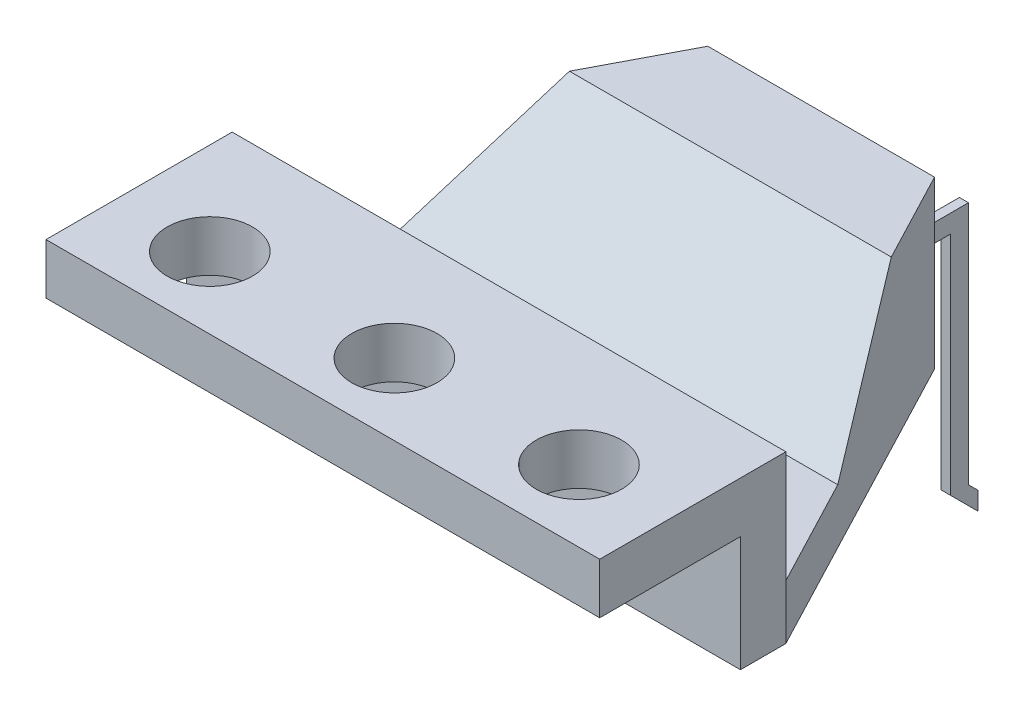
ISO-10303-21;
HEADER;
FILE_DESCRIPTION(('STEP AP214'),'2;1');
FILE_NAME('part.step','',(''),(''),'','','');
FILE_SCHEMA(('AUTOMOTIVE_DESIGN { 1 0 10303 214 1 1 1 1 }'));
ENDSEC;
DATA;
#1=APPLICATION_CONTEXT('core data for automotive mechanical design processes');
#2=APPLICATION_PROTOCOL_DEFINITION('international standard','automotive_design',2000,#1);
#3=PRODUCT_CONTEXT('',#1,'mechanical');
#4=PRODUCT('Part','Part','',(#3));
#5=PRODUCT_RELATED_PRODUCT_CATEGORY('part','',(#4));
#6=PRODUCT_DEFINITION_FORMATION('','',#4);
#7=PRODUCT_DEFINITION_CONTEXT('part definition',#1,'design');
#8=PRODUCT_DEFINITION('design','',#6,#7);
#9=PRODUCT_DEFINITION_SHAPE('','',#8);
#10=(LENGTH_UNIT() NAMED_UNIT(*) SI_UNIT(.MILLI.,.METRE.));
#11=(NAMED_UNIT(*) PLANE_ANGLE_UNIT() SI_UNIT($,.RADIAN.));
#12=(NAMED_UNIT(*) SI_UNIT($,.STERADIAN.) SOLID_ANGLE_UNIT());
#13=UNCERTAINTY_MEASURE_WITH_UNIT(LENGTH_MEASURE(1.E-05),#10,'distance_accuracy_value','');
#14=(GEOMETRIC_REPRESENTATION_CONTEXT(3) GLOBAL_UNCERTAINTY_ASSIGNED_CONTEXT((#13)) GLOBAL_UNIT_ASSIGNED_CONTEXT((#10,
#11,#12)) REPRESENTATION_CONTEXT('',''));
#15=CARTESIAN_POINT('',(0.,0.,0.));
#16=DIRECTION('',(0.,0.,1.));
#17=DIRECTION('',(1.,0.,0.));
#18=AXIS2_PLACEMENT_3D('',#15,#16,#17);
#19=CARTESIAN_POINT('',(30.48,0.,-27.432));
#20=DIRECTION('',(0.,0.,1.));
#21=DIRECTION('',(1.,0.,0.));
#22=AXIS2_PLACEMENT_3D('',#19,#20,#21);
#23=PLANE('',#22);
#24=DIRECTION('',(0.,1.,0.));
#25=VECTOR('',#24,1.);
#26=CARTESIAN_POINT('',(14.99,0.,-27.432));
#27=LINE('',#26,#25);
#28=CARTESIAN_POINT('',(14.99,-9.144,-27.432));
#29=VERTEX_POINT('',#28);
#30=CARTESIAN_POINT('',(14.99,-8.144,-27.432));
#31=VERTEX_POINT('',#30);
#32=EDGE_CURVE('E62',#29,#31,#27,.T.);
#33=ORIENTED_EDGE('',*,*,#32,.F.);
#34=DIRECTION('',(-1.,0.,0.));
#35=VECTOR('',#34,1.);
#36=CARTESIAN_POINT('',(30.48,-9.144,-27.432));
#37=LINE('',#36,#35);
#38=CARTESIAN_POINT('',(9.,-9.144,-27.432));
#39=VERTEX_POINT('',#38);
#40=EDGE_CURVE('E283',#29,#39,#37,.T.);
#41=ORIENTED_EDGE('',*,*,#40,.T.);
#42=DIRECTION('',(0.,1.,0.));
#43=VECTOR('',#42,1.);
#44=CARTESIAN_POINT('',(9.,-10.,-27.432));
#45=LINE('',#44,#43);
#46=CARTESIAN_POINT('',(9.,0.,-27.432));
#47=VERTEX_POINT('',#46);
#48=EDGE_CURVE('E223',#39,#47,#45,.T.);
#49=ORIENTED_EDGE('',*,*,#48,.T.);
#50=DIRECTION('',(-1.,0.,0.));
#51=VECTOR('',#50,1.);
#52=CARTESIAN_POINT('',(30.48,0.,-27.432));
#53=LINE('',#52,#51);
#54=CARTESIAN_POINT('',(21.48,0.,-27.432));
#55=VERTEX_POINT('',#54);
#56=EDGE_CURVE('E280',#55,#47,#53,.T.);
#57=ORIENTED_EDGE('',*,*,#56,.F.);
#58=DIRECTION('',(0.,1.,0.));
#59=VECTOR('',#58,1.);
#60=CARTESIAN_POINT('',(21.48,-10.,-27.432));
#61=LINE('',#60,#59);
#62=CARTESIAN_POINT('',(21.48,-9.144,-27.432));
#63=VERTEX_POINT('',#62);
#64=EDGE_CURVE('E217',#63,#55,#61,.T.);
#65=ORIENTED_EDGE('',*,*,#64,.F.);
#66=CARTESIAN_POINT('',(15.49,-9.144,-27.432));
#67=VERTEX_POINT('',#66);
#68=EDGE_CURVE('E284',#63,#67,#37,.T.);
#69=ORIENTED_EDGE('',*,*,#68,.T.);
#70=DIRECTION('',(0.,1.,0.));
#71=VECTOR('',#70,1.);
#72=CARTESIAN_POINT('',(15.49,0.,-27.432));
#73=LINE('',#72,#71);
#74=CARTESIAN_POINT('',(15.49,-8.144,-27.432));
#75=VERTEX_POINT('',#74);
#76=EDGE_CURVE('E623',#67,#75,#73,.T.);
#77=ORIENTED_EDGE('',*,*,#76,.T.);
#78=DIRECTION('',(-1.,0.,0.));
#79=VECTOR('',#78,1.);
#80=CARTESIAN_POINT('',(15.49,-8.144,-27.432));
#81=LINE('',#80,#79);
#82=EDGE_CURVE('E208',#75,#31,#81,.T.);
#83=ORIENTED_EDGE('',*,*,#82,.T.);
#84=EDGE_LOOP('',(#33,#41,#49,#57,#65,#69,#77,#83));
#85=FACE_BOUND('',#84,.T.);
#86=ADVANCED_FACE('F45',(#85),#23,.F.);
#87=CARTESIAN_POINT('',(30.48,0.,-10.247));
#88=DIRECTION('',(0.,0.,1.));
#89=DIRECTION('',(1.,0.,0.));
#90=AXIS2_PLACEMENT_3D('',#87,#88,#89);
#91=PLANE('',#90);
#92=DIRECTION('',(0.,1.,0.));
#93=VECTOR('',#92,1.);
#94=CARTESIAN_POINT('',(0.,0.,-10.247));
#95=LINE('',#94,#93);
#96=CARTESIAN_POINT('',(0.,-6.144,-10.247));
#97=VERTEX_POINT('',#96);
#98=CARTESIAN_POINT('',(0.,0.,-10.247));
#99=VERTEX_POINT('',#98);
#100=EDGE_CURVE('E259',#97,#99,#95,.T.);
#101=ORIENTED_EDGE('',*,*,#100,.T.);
#102=DIRECTION('',(-1.,0.,0.));
#103=VECTOR('',#102,1.);
#104=CARTESIAN_POINT('',(30.48,0.,-10.247));
#105=LINE('',#104,#103);
#106=CARTESIAN_POINT('',(30.48,0.,-10.247));
#107=VERTEX_POINT('',#106);
#108=EDGE_CURVE('E299',#107,#99,#105,.T.);
#109=ORIENTED_EDGE('',*,*,#108,.F.);
#110=DIRECTION('',(0.,1.,0.));
#111=VECTOR('',#110,1.);
#112=CARTESIAN_POINT('',(30.48,0.,-10.247));
#113=LINE('',#112,#111);
#114=CARTESIAN_POINT('',(30.48,-6.144,-10.247));
#115=VERTEX_POINT('',#114);
#116=EDGE_CURVE('E243',#115,#107,#113,.T.);
#117=ORIENTED_EDGE('',*,*,#116,.F.);
#118=DIRECTION('',(-1.,0.,0.));
#119=VECTOR('',#118,1.);
#120=CARTESIAN_POINT('',(30.48,-6.144,-10.247));
#121=LINE('',#120,#119);
#122=EDGE_CURVE('E258',#115,#97,#121,.T.);
#123=ORIENTED_EDGE('',*,*,#122,.T.);
#124=EDGE_LOOP('',(#101,#109,#117,#123));
#125=FACE_BOUND('',#124,.T.);
#126=ADVANCED_FACE('F47',(#125),#91,.F.);
#127=CARTESIAN_POINT('',(30.48,0.,0.));
#128=DIRECTION('',(0.,-1.,0.));
#129=DIRECTION('',(0.,0.,-1.));
#130=AXIS2_PLACEMENT_3D('',#127,#128,#129);
#131=PLANE('',#130);
#132=CARTESIAN_POINT('',(5.08,0.,-3.937));
#133=DIRECTION('',(0.,1.,0.));
#134=DIRECTION('',(0.,0.,1.));
#135=AXIS2_PLACEMENT_3D('',#132,#133,#134);
#136=CIRCLE('',#135,2.3495);
#137=CARTESIAN_POINT('',(5.08,0.,-1.5875));
#138=VERTEX_POINT('',#137);
#139=EDGE_CURVE('E213',#138,#138,#136,.T.);
#140=ORIENTED_EDGE('',*,*,#139,.F.);
#141=EDGE_LOOP('',(#140));
#142=FACE_BOUND('',#141,.T.);
#143=CARTESIAN_POINT('',(15.24,0.,-3.937));
#144=DIRECTION('',(0.,1.,0.));
#145=DIRECTION('',(0.,0.,1.));
#146=AXIS2_PLACEMENT_3D('',#143,#144,#145);
#147=CIRCLE('',#146,2.34950000000002);
#148=CARTESIAN_POINT('',(15.24,0.,-1.58749999999998));
#149=VERTEX_POINT('',#148);
#150=EDGE_CURVE('E206',#149,#149,#147,.T.);
#151=ORIENTED_EDGE('',*,*,#150,.F.);
#152=EDGE_LOOP('',(#151));
#153=FACE_BOUND('',#152,.T.);
#154=CARTESIAN_POINT('',(25.4,0.,-3.937));
#155=DIRECTION('',(0.,1.,0.));
#156=DIRECTION('',(0.,0.,1.));
#157=AXIS2_PLACEMENT_3D('',#154,#155,#156);
#158=CIRCLE('',#157,2.3495);
#159=CARTESIAN_POINT('',(25.4,0.,-1.5875));
#160=VERTEX_POINT('',#159);
#161=EDGE_CURVE('E203',#160,#160,#158,.T.);
#162=ORIENTED_EDGE('',*,*,#161,.F.);
#163=EDGE_LOOP('',(#162));
#164=FACE_BOUND('',#163,.T.);
#165=DIRECTION('',(0.,0.,1.));
#166=VECTOR('',#165,1.);
#167=CARTESIAN_POINT('',(0.,0.,0.));
#168=LINE('',#167,#166);
#169=CARTESIAN_POINT('',(0.,0.,0.));
#170=VERTEX_POINT('',#169);
#171=EDGE_CURVE('E262',#99,#170,#168,.T.);
#172=ORIENTED_EDGE('',*,*,#171,.T.);
#173=DIRECTION('',(-1.,0.,0.));
#174=VECTOR('',#173,1.);
#175=CARTESIAN_POINT('',(30.48,0.,0.));
#176=LINE('',#175,#174);
#177=CARTESIAN_POINT('',(30.48,0.,0.));
#178=VERTEX_POINT('',#177);
#179=EDGE_CURVE('E296',#178,#170,#176,.T.);
#180=ORIENTED_EDGE('',*,*,#179,.F.);
#181=DIRECTION('',(0.,0.,1.));
#182=VECTOR('',#181,1.);
#183=CARTESIAN_POINT('',(30.48,0.,0.));
#184=LINE('',#183,#182);
#185=EDGE_CURVE('E246',#107,#178,#184,.T.);
#186=ORIENTED_EDGE('',*,*,#185,.F.);
#187=ORIENTED_EDGE('',*,*,#108,.T.);
#188=EDGE_LOOP('',(#172,#180,#186,#187));
#189=FACE_BOUND('',#188,.T.);
#190=ADVANCED_FACE('F334',(#142,#153,#164,#189),#131,.F.);
#191=CARTESIAN_POINT('',(30.48,0.,0.));
#192=DIRECTION('',(0.,0.,-1.));
#193=DIRECTION('',(0.,1.,0.));
#194=AXIS2_PLACEMENT_3D('',#191,#192,#193);
#195=PLANE('',#194);
#196=DIRECTION('',(0.,-1.,0.));
#197=VECTOR('',#196,1.);
#198=CARTESIAN_POINT('',(0.,0.,0.));
#199=LINE('',#198,#197);
#200=CARTESIAN_POINT('',(0.,-2.794,0.));
#201=VERTEX_POINT('',#200);
#202=EDGE_CURVE('E264',#170,#201,#199,.T.);
#203=ORIENTED_EDGE('',*,*,#202,.T.);
#204=DIRECTION('',(-1.,0.,0.));
#205=VECTOR('',#204,1.);
#206=CARTESIAN_POINT('',(30.48,-2.794,0.));
#207=LINE('',#206,#205);
#208=CARTESIAN_POINT('',(30.48,-2.794,0.));
#209=VERTEX_POINT('',#208);
#210=EDGE_CURVE('E293',#209,#201,#207,.T.);
#211=ORIENTED_EDGE('',*,*,#210,.F.);
#212=DIRECTION('',(0.,-1.,0.));
#213=VECTOR('',#212,1.);
#214=CARTESIAN_POINT('',(30.48,0.,0.));
#215=LINE('',#214,#213);
#216=EDGE_CURVE('E249',#178,#209,#215,.T.);
#217=ORIENTED_EDGE('',*,*,#216,.F.);
#218=ORIENTED_EDGE('',*,*,#179,.T.);
#219=EDGE_LOOP('',(#203,#211,#217,#218));
#220=FACE_BOUND('',#219,.T.);
#221=ADVANCED_FACE('F350',(#220),#195,.F.);
#222=CARTESIAN_POINT('',(30.48,-2.794,0.));
#223=DIRECTION('',(0.,1.,0.));
#224=DIRECTION('',(0.,0.,1.));
#225=AXIS2_PLACEMENT_3D('',#222,#223,#224);
#226=PLANE('',#225);
#227=CARTESIAN_POINT('',(5.08,-2.794,-3.937));
#228=DIRECTION('',(0.,1.,0.));
#229=DIRECTION('',(0.,0.,1.));
#230=AXIS2_PLACEMENT_3D('',#227,#228,#229);
#231=CIRCLE('',#230,2.3495);
#232=CARTESIAN_POINT('',(5.08,-2.794,-1.5875));
#233=VERTEX_POINT('',#232);
#234=EDGE_CURVE('E49',#233,#233,#231,.T.);
#235=ORIENTED_EDGE('',*,*,#234,.T.);
#236=EDGE_LOOP('',(#235));
#237=FACE_BOUND('',#236,.T.);
#238=CARTESIAN_POINT('',(15.24,-2.794,-3.937));
#239=DIRECTION('',(0.,1.,0.));
#240=DIRECTION('',(0.,0.,1.));
#241=AXIS2_PLACEMENT_3D('',#238,#239,#240);
#242=CIRCLE('',#241,2.34950000000002);
#243=CARTESIAN_POINT('',(15.24,-2.794,-1.58749999999998));
#244=VERTEX_POINT('',#243);
#245=EDGE_CURVE('E304',#244,#244,#242,.T.);
#246=ORIENTED_EDGE('',*,*,#245,.T.);
#247=EDGE_LOOP('',(#246));
#248=FACE_BOUND('',#247,.T.);
#249=CARTESIAN_POINT('',(25.4,-2.794,-3.937));
#250=DIRECTION('',(0.,1.,0.));
#251=DIRECTION('',(0.,0.,1.));
#252=AXIS2_PLACEMENT_3D('',#249,#250,#251);
#253=CIRCLE('',#252,2.3495);
#254=CARTESIAN_POINT('',(25.4,-2.794,-1.5875));
#255=VERTEX_POINT('',#254);
#256=EDGE_CURVE('E242',#255,#255,#253,.T.);
#257=ORIENTED_EDGE('',*,*,#256,.T.);
#258=EDGE_LOOP('',(#257));
#259=FACE_BOUND('',#258,.T.);
#260=DIRECTION('',(0.,0.,-1.));
#261=VECTOR('',#260,1.);
#262=CARTESIAN_POINT('',(0.,-2.794,0.));
#263=LINE('',#262,#261);
#264=CARTESIAN_POINT('',(0.,-2.794,-7.747));
#265=VERTEX_POINT('',#264);
#266=EDGE_CURVE('E266',#201,#265,#263,.T.);
#267=ORIENTED_EDGE('',*,*,#266,.T.);
#268=DIRECTION('',(-1.,0.,0.));
#269=VECTOR('',#268,1.);
#270=CARTESIAN_POINT('',(30.48,-2.794,-7.747));
#271=LINE('',#270,#269);
#272=CARTESIAN_POINT('',(30.48,-2.794,-7.747));
#273=VERTEX_POINT('',#272);
#274=EDGE_CURVE('E290',#273,#265,#271,.T.);
#275=ORIENTED_EDGE('',*,*,#274,.F.);
#276=DIRECTION('',(0.,0.,-1.));
#277=VECTOR('',#276,1.);
#278=CARTESIAN_POINT('',(30.48,-2.794,0.));
#279=LINE('',#278,#277);
#280=EDGE_CURVE('E251',#209,#273,#279,.T.);
#281=ORIENTED_EDGE('',*,*,#280,.F.);
#282=ORIENTED_EDGE('',*,*,#210,.T.);
#283=EDGE_LOOP('',(#267,#275,#281,#282));
#284=FACE_BOUND('',#283,.T.);
#285=ADVANCED_FACE('F311',(#237,#248,#259,#284),#226,.F.);
#286=CARTESIAN_POINT('',(30.48,0.,-7.747));
#287=DIRECTION('',(0.,0.,-1.));
#288=DIRECTION('',(0.,1.,0.));
#289=AXIS2_PLACEMENT_3D('',#286,#287,#288);
#290=PLANE('',#289);
#291=DIRECTION('',(0.,-1.,0.));
#292=VECTOR('',#291,1.);
#293=CARTESIAN_POINT('',(0.,0.,-7.747));
#294=LINE('',#293,#292);
#295=CARTESIAN_POINT('',(0.,-9.144,-7.747));
#296=VERTEX_POINT('',#295);
#297=EDGE_CURVE('E268',#265,#296,#294,.T.);
#298=ORIENTED_EDGE('',*,*,#297,.T.);
#299=DIRECTION('',(-1.,0.,0.));
#300=VECTOR('',#299,1.);
#301=CARTESIAN_POINT('',(30.48,-9.144,-7.747));
#302=LINE('',#301,#300);
#303=CARTESIAN_POINT('',(30.48,-9.144,-7.747));
#304=VERTEX_POINT('',#303);
#305=EDGE_CURVE('E287',#304,#296,#302,.T.);
#306=ORIENTED_EDGE('',*,*,#305,.F.);
#307=DIRECTION('',(0.,-1.,0.));
#308=VECTOR('',#307,1.);
#309=CARTESIAN_POINT('',(30.48,0.,-7.747));
#310=LINE('',#309,#308);
#311=EDGE_CURVE('E253',#273,#304,#310,.T.);
#312=ORIENTED_EDGE('',*,*,#311,.F.);
#313=ORIENTED_EDGE('',*,*,#274,.T.);
#314=EDGE_LOOP('',(#298,#306,#312,#313));
#315=FACE_BOUND('',#314,.T.);
#316=ADVANCED_FACE('F343',(#315),#290,.F.);
#317=CARTESIAN_POINT('',(30.48,-9.144,0.));
#318=DIRECTION('',(0.,1.,0.));
#319=DIRECTION('',(0.,0.,1.));
#320=AXIS2_PLACEMENT_3D('',#317,#318,#319);
#321=PLANE('',#320);
#322=ORIENTED_EDGE('',*,*,#68,.F.);
#323=DIRECTION('',(0.46393957624718,0.,0.885866846423088));
#324=VECTOR('',#323,1.);
#325=CARTESIAN_POINT('',(34.6914010996767,-9.144,-2.20556356689501));
#326=LINE('',#325,#324);
#327=CARTESIAN_POINT('',(30.48,-9.144,-10.247));
#328=VERTEX_POINT('',#327);
#329=EDGE_CURVE('E239',#63,#328,#326,.T.);
#330=ORIENTED_EDGE('',*,*,#329,.T.);
#331=DIRECTION('',(0.,0.,-1.));
#332=VECTOR('',#331,1.);
#333=CARTESIAN_POINT('',(30.48,-9.144,0.));
#334=LINE('',#333,#332);
#335=EDGE_CURVE('E255',#304,#328,#334,.T.);
#336=ORIENTED_EDGE('',*,*,#335,.F.);
#337=ORIENTED_EDGE('',*,*,#305,.T.);
#338=DIRECTION('',(0.,0.,-1.));
#339=VECTOR('',#338,1.);
#340=CARTESIAN_POINT('',(0.,-9.144,0.));
#341=LINE('',#340,#339);
#342=CARTESIAN_POINT('',(0.,-9.144,-10.247));
#343=VERTEX_POINT('',#342);
#344=EDGE_CURVE('E247',#296,#343,#341,.T.);
#345=ORIENTED_EDGE('',*,*,#344,.T.);
#346=DIRECTION('',(0.46393957624718,0.,-0.885866846423088));
#347=VECTOR('',#346,1.);
#348=CARTESIAN_POINT('',(2.34911197917168,-9.144,-14.7324988180073));
#349=LINE('',#348,#347);
#350=EDGE_CURVE('E70',#343,#39,#349,.T.);
#351=ORIENTED_EDGE('',*,*,#350,.T.);
#352=ORIENTED_EDGE('',*,*,#40,.F.);
#353=DIRECTION('',(0.,0.,-1.));
#354=VECTOR('',#353,1.);
#355=CARTESIAN_POINT('',(14.99,-9.144,0.));
#356=LINE('',#355,#354);
#357=CARTESIAN_POINT('',(14.99,-9.144,-34.29));
#358=VERTEX_POINT('',#357);
#359=EDGE_CURVE('E626',#29,#358,#356,.T.);
#360=ORIENTED_EDGE('',*,*,#359,.T.);
#361=DIRECTION('',(-1.,0.,0.));
#362=VECTOR('',#361,1.);
#363=CARTESIAN_POINT('',(15.49,-9.144,-34.29));
#364=LINE('',#363,#362);
#365=CARTESIAN_POINT('',(15.49,-9.144,-34.29));
#366=VERTEX_POINT('',#365);
#367=EDGE_CURVE('E618',#366,#358,#364,.T.);
#368=ORIENTED_EDGE('',*,*,#367,.F.);
#369=DIRECTION('',(0.,0.,-1.));
#370=VECTOR('',#369,1.);
#371=CARTESIAN_POINT('',(15.49,-9.144,0.));
#372=LINE('',#371,#370);
#373=EDGE_CURVE('E639',#67,#366,#372,.T.);
#374=ORIENTED_EDGE('',*,*,#373,.F.);
#375=EDGE_LOOP('',(#322,#330,#336,#337,#345,#351,#352,#360,#368,#374));
#376=FACE_BOUND('',#375,.T.);
#377=ADVANCED_FACE('F340',(#376),#321,.F.);
#378=CARTESIAN_POINT('',(30.48,0.,0.));
#379=DIRECTION('',(0.,-1.,0.));
#380=DIRECTION('',(0.,0.,-1.));
#381=AXIS2_PLACEMENT_3D('',#378,#379,#380);
#382=PLANE('',#381);
#383=DIRECTION('',(-1.,0.,0.));
#384=VECTOR('',#383,1.);
#385=CARTESIAN_POINT('',(30.48,0.,-22.432));
#386=LINE('',#385,#384);
#387=CARTESIAN_POINT('',(24.0985627000291,0.,-22.432));
#388=VERTEX_POINT('',#387);
#389=CARTESIAN_POINT('',(6.38143729997091,0.,-22.432));
#390=VERTEX_POINT('',#389);
#391=EDGE_CURVE('E277',#388,#390,#386,.T.);
#392=ORIENTED_EDGE('',*,*,#391,.F.);
#393=DIRECTION('',(0.46393957624718,0.,0.885866846423088));
#394=VECTOR('',#393,1.);
#395=CARTESIAN_POINT('',(21.48,0.,-27.432));
#396=LINE('',#395,#394);
#397=EDGE_CURVE('E215',#55,#388,#396,.T.);
#398=ORIENTED_EDGE('',*,*,#397,.F.);
#399=ORIENTED_EDGE('',*,*,#56,.T.);
#400=DIRECTION('',(0.46393957624718,0.,-0.885866846423088));
#401=VECTOR('',#400,1.);
#402=CARTESIAN_POINT('',(9.,0.,-27.432));
#403=LINE('',#402,#401);
#404=EDGE_CURVE('E219',#390,#47,#403,.T.);
#405=ORIENTED_EDGE('',*,*,#404,.F.);
#406=EDGE_LOOP('',(#392,#398,#399,#405));
#407=FACE_BOUND('',#406,.T.);
#408=ADVANCED_FACE('F338',(#407),#382,.F.);
#409=CARTESIAN_POINT('',(30.48,-11.2157519294544,-11.1414033717976));
#410=DIRECTION('',(0.,-0.709454336772143,-0.704751405841236));
#411=DIRECTION('',(0.,0.704751405841236,-0.709454336772143));
#412=AXIS2_PLACEMENT_3D('',#409,#410,#411);
#413=PLANE('',#412);
#414=DIRECTION('',(-1.,0.,0.));
#415=VECTOR('',#414,1.);
#416=CARTESIAN_POINT('',(30.48,-6.144,-16.247));
#417=LINE('',#416,#415);
#418=CARTESIAN_POINT('',(27.3377247599651,-6.144,-16.247));
#419=VERTEX_POINT('',#418);
#420=CARTESIAN_POINT('',(3.14227524003491,-6.144,-16.247));
#421=VERTEX_POINT('',#420);
#422=EDGE_CURVE('E274',#419,#421,#417,.T.);
#423=ORIENTED_EDGE('',*,*,#422,.F.);
#424=DIRECTION('',(-0.348286663118426,0.660625562600562,-0.665034033965573));
#425=VECTOR('',#424,1.);
#426=CARTESIAN_POINT('',(30.0684095892416,-11.3235270754087,-11.0329090232092));
#427=LINE('',#426,#425);
#428=EDGE_CURVE('E236',#419,#388,#427,.T.);
#429=ORIENTED_EDGE('',*,*,#428,.T.);
#430=ORIENTED_EDGE('',*,*,#391,.T.);
#431=DIRECTION('',(-0.348286663118426,-0.660625562600562,0.665034033965573));
#432=VECTOR('',#431,1.);
#433=CARTESIAN_POINT('',(4.10892412980238,-4.31047309741313,-18.0927623522949));
#434=LINE('',#433,#432);
#435=EDGE_CURVE('E229',#390,#421,#434,.T.);
#436=ORIENTED_EDGE('',*,*,#435,.T.);
#437=EDGE_LOOP('',(#423,#429,#430,#436));
#438=FACE_BOUND('',#437,.T.);
#439=ADVANCED_FACE('F398',(#438),#413,.F.);
#440=CARTESIAN_POINT('',(30.48,-6.144,0.));
#441=DIRECTION('',(0.,-1.,0.));
#442=DIRECTION('',(0.,0.,-1.));
#443=AXIS2_PLACEMENT_3D('',#440,#441,#442);
#444=PLANE('',#443);
#445=ORIENTED_EDGE('',*,*,#122,.F.);
#446=DIRECTION('',(-0.46393957624718,0.,-0.885866846423088));
#447=VECTOR('',#446,1.);
#448=CARTESIAN_POINT('',(34.6914010996767,-6.144,-2.20556356689501));
#449=LINE('',#448,#447);
#450=EDGE_CURVE('E233',#115,#419,#449,.T.);
#451=ORIENTED_EDGE('',*,*,#450,.T.);
#452=ORIENTED_EDGE('',*,*,#422,.T.);
#453=DIRECTION('',(-0.46393957624718,0.,0.885866846423088));
#454=VECTOR('',#453,1.);
#455=CARTESIAN_POINT('',(2.34911197917168,-6.144,-14.7324988180073));
#456=LINE('',#455,#454);
#457=EDGE_CURVE('E226',#421,#97,#456,.T.);
#458=ORIENTED_EDGE('',*,*,#457,.T.);
#459=EDGE_LOOP('',(#445,#451,#452,#458));
#460=FACE_BOUND('',#459,.T.);
#461=ADVANCED_FACE('F400',(#460),#444,.F.);
#462=CARTESIAN_POINT('',(30.48,0.,0.));
#463=DIRECTION('',(1.,0.,0.));
#464=DIRECTION('',(0.,0.,-1.));
#465=AXIS2_PLACEMENT_3D('',#462,#463,#464);
#466=PLANE('',#465);
#467=DIRECTION('',(0.,-1.,0.));
#468=VECTOR('',#467,1.);
#469=CARTESIAN_POINT('',(30.48,0.,-10.247));
#470=LINE('',#469,#468);
#471=EDGE_CURVE('E11',#115,#328,#470,.T.);
#472=ORIENTED_EDGE('',*,*,#471,.F.);
#473=ORIENTED_EDGE('',*,*,#116,.T.);
#474=ORIENTED_EDGE('',*,*,#185,.T.);
#475=ORIENTED_EDGE('',*,*,#216,.T.);
#476=ORIENTED_EDGE('',*,*,#280,.T.);
#477=ORIENTED_EDGE('',*,*,#311,.T.);
#478=ORIENTED_EDGE('',*,*,#335,.T.);
#479=EDGE_LOOP('',(#472,#473,#474,#475,#476,#477,#478));
#480=FACE_BOUND('',#479,.T.);
#481=ADVANCED_FACE('F382',(#480),#466,.T.);
#482=CARTESIAN_POINT('',(0.,0.,0.));
#483=DIRECTION('',(1.,0.,0.));
#484=DIRECTION('',(0.,0.,-1.));
#485=AXIS2_PLACEMENT_3D('',#482,#483,#484);
#486=PLANE('',#485);
#487=ORIENTED_EDGE('',*,*,#100,.F.);
#488=DIRECTION('',(0.,-1.,0.));
#489=VECTOR('',#488,1.);
#490=CARTESIAN_POINT('',(0.,0.,-10.247));
#491=LINE('',#490,#489);
#492=EDGE_CURVE('E54',#97,#343,#491,.T.);
#493=ORIENTED_EDGE('',*,*,#492,.T.);
#494=ORIENTED_EDGE('',*,*,#344,.F.);
#495=ORIENTED_EDGE('',*,*,#297,.F.);
#496=ORIENTED_EDGE('',*,*,#266,.F.);
#497=ORIENTED_EDGE('',*,*,#202,.F.);
#498=ORIENTED_EDGE('',*,*,#171,.F.);
#499=EDGE_LOOP('',(#487,#493,#494,#495,#496,#497,#498));
#500=FACE_BOUND('',#499,.T.);
#501=ADVANCED_FACE('F371',(#500),#486,.F.);
#502=CARTESIAN_POINT('',(9.,-10.,-27.432));
#503=DIRECTION('',(0.885866846423088,0.,0.46393957624718));
#504=DIRECTION('',(0.46393957624718,0.,-0.885866846423088));
#505=AXIS2_PLACEMENT_3D('',#502,#503,#504);
#506=PLANE('',#505);
#507=ORIENTED_EDGE('',*,*,#492,.F.);
#508=ORIENTED_EDGE('',*,*,#457,.F.);
#509=ORIENTED_EDGE('',*,*,#435,.F.);
#510=ORIENTED_EDGE('',*,*,#404,.T.);
#511=ORIENTED_EDGE('',*,*,#48,.F.);
#512=ORIENTED_EDGE('',*,*,#350,.F.);
#513=EDGE_LOOP('',(#507,#508,#509,#510,#511,#512));
#514=FACE_BOUND('',#513,.T.);
#515=ADVANCED_FACE('F401',(#514),#506,.F.);
#516=CARTESIAN_POINT('',(21.48,-10.,-27.432));
#517=DIRECTION('',(-0.885866846423088,0.,0.46393957624718));
#518=DIRECTION('',(0.46393957624718,0.,0.885866846423088));
#519=AXIS2_PLACEMENT_3D('',#516,#517,#518);
#520=PLANE('',#519);
#521=ORIENTED_EDGE('',*,*,#64,.T.);
#522=ORIENTED_EDGE('',*,*,#397,.T.);
#523=ORIENTED_EDGE('',*,*,#428,.F.);
#524=ORIENTED_EDGE('',*,*,#450,.F.);
#525=ORIENTED_EDGE('',*,*,#471,.T.);
#526=ORIENTED_EDGE('',*,*,#329,.F.);
#527=EDGE_LOOP('',(#521,#522,#523,#524,#525,#526));
#528=FACE_BOUND('',#527,.T.);
#529=ADVANCED_FACE('F389',(#528),#520,.F.);
#530=CARTESIAN_POINT('',(25.4,-10.,-3.937));
#531=DIRECTION('',(0.,1.,0.));
#532=DIRECTION('',(0.,0.,1.));
#533=AXIS2_PLACEMENT_3D('',#530,#531,#532);
#534=CYLINDRICAL_SURFACE('',#533,2.3495);
#535=ORIENTED_EDGE('',*,*,#161,.T.);
#536=EDGE_LOOP('',(#535));
#537=FACE_BOUND('',#536,.T.);
#538=ORIENTED_EDGE('',*,*,#256,.F.);
#539=EDGE_LOOP('',(#538));
#540=FACE_BOUND('',#539,.T.);
#541=ADVANCED_FACE('F323',(#537,#540),#534,.F.);
#542=CARTESIAN_POINT('',(15.24,-10.,-3.937));
#543=DIRECTION('',(0.,1.,0.));
#544=DIRECTION('',(0.,0.,1.));
#545=AXIS2_PLACEMENT_3D('',#542,#543,#544);
#546=CYLINDRICAL_SURFACE('',#545,2.34950000000002);
#547=ORIENTED_EDGE('',*,*,#150,.T.);
#548=EDGE_LOOP('',(#547));
#549=FACE_BOUND('',#548,.T.);
#550=ORIENTED_EDGE('',*,*,#245,.F.);
#551=EDGE_LOOP('',(#550));
#552=FACE_BOUND('',#551,.T.);
#553=ADVANCED_FACE('F315',(#549,#552),#546,.F.);
#554=CARTESIAN_POINT('',(5.08,-10.,-3.937));
#555=DIRECTION('',(0.,1.,0.));
#556=DIRECTION('',(0.,0.,1.));
#557=AXIS2_PLACEMENT_3D('',#554,#555,#556);
#558=CYLINDRICAL_SURFACE('',#557,2.3495);
#559=ORIENTED_EDGE('',*,*,#139,.T.);
#560=EDGE_LOOP('',(#559));
#561=FACE_BOUND('',#560,.T.);
#562=ORIENTED_EDGE('',*,*,#234,.F.);
#563=EDGE_LOOP('',(#562));
#564=FACE_BOUND('',#563,.T.);
#565=ADVANCED_FACE('F313',(#561,#564),#558,.F.);
#566=CARTESIAN_POINT('',(15.49,6.85000000000007,-6.85000000000012));
#567=DIRECTION('',(0.,-0.707106781186545,0.70710678118655));
#568=DIRECTION('',(0.,-0.70710678118655,-0.707106781186545));
#569=AXIS2_PLACEMENT_3D('',#566,#567,#568);
#570=PLANE('',#569);
#571=DIRECTION('',(0.,0.70710678118655,0.707106781186545));
#572=VECTOR('',#571,1.);
#573=CARTESIAN_POINT('',(14.99,6.85000000000007,-6.85000000000012));
#574=LINE('',#573,#572);
#575=CARTESIAN_POINT('',(14.99,-22.114,-35.814));
#576=VERTEX_POINT('',#575);
#577=CARTESIAN_POINT('',(14.99,-21.59,-35.29));
#578=VERTEX_POINT('',#577);
#579=EDGE_CURVE('E202',#576,#578,#574,.T.);
#580=ORIENTED_EDGE('',*,*,#579,.T.);
#581=DIRECTION('',(-1.,0.,0.));
#582=VECTOR('',#581,1.);
#583=CARTESIAN_POINT('',(15.49,-21.59,-35.29));
#584=LINE('',#583,#582);
#585=CARTESIAN_POINT('',(15.49,-21.59,-35.29));
#586=VERTEX_POINT('',#585);
#587=EDGE_CURVE('E183',#586,#578,#584,.T.);
#588=ORIENTED_EDGE('',*,*,#587,.F.);
#589=DIRECTION('',(0.,0.70710678118655,0.707106781186545));
#590=VECTOR('',#589,1.);
#591=CARTESIAN_POINT('',(15.49,6.85000000000007,-6.85000000000012));
#592=LINE('',#591,#590);
#593=CARTESIAN_POINT('',(15.49,-22.114,-35.814));
#594=VERTEX_POINT('',#593);
#595=EDGE_CURVE('E190',#594,#586,#592,.T.);
#596=ORIENTED_EDGE('',*,*,#595,.F.);
#597=DIRECTION('',(-1.,0.,0.));
#598=VECTOR('',#597,1.);
#599=CARTESIAN_POINT('',(15.49,-22.114,-35.814));
#600=LINE('',#599,#598);
#601=EDGE_CURVE('E603',#594,#576,#600,.T.);
#602=ORIENTED_EDGE('',*,*,#601,.T.);
#603=EDGE_LOOP('',(#580,#588,#596,#602));
#604=FACE_BOUND('',#603,.T.);
#605=ADVANCED_FACE('F200',(#604),#570,.F.);
#606=CARTESIAN_POINT('',(15.49,0.,-35.29));
#607=DIRECTION('',(0.,0.,1.));
#608=DIRECTION('',(1.,0.,0.));
#609=AXIS2_PLACEMENT_3D('',#606,#607,#608);
#610=PLANE('',#609);
#611=DIRECTION('',(0.,1.,0.));
#612=VECTOR('',#611,1.);
#613=CARTESIAN_POINT('',(14.99,0.,-35.29));
#614=LINE('',#613,#612);
#615=CARTESIAN_POINT('',(14.99,-8.144,-35.29));
#616=VERTEX_POINT('',#615);
#617=EDGE_CURVE('E601',#578,#616,#614,.T.);
#618=ORIENTED_EDGE('',*,*,#617,.T.);
#619=DIRECTION('',(-1.,0.,0.));
#620=VECTOR('',#619,1.);
#621=CARTESIAN_POINT('',(15.49,-8.144,-35.29));
#622=LINE('',#621,#620);
#623=CARTESIAN_POINT('',(15.49,-8.144,-35.29));
#624=VERTEX_POINT('',#623);
#625=EDGE_CURVE('E186',#624,#616,#622,.T.);
#626=ORIENTED_EDGE('',*,*,#625,.F.);
#627=DIRECTION('',(0.,1.,0.));
#628=VECTOR('',#627,1.);
#629=CARTESIAN_POINT('',(15.49,0.,-35.29));
#630=LINE('',#629,#628);
#631=EDGE_CURVE('E179',#586,#624,#630,.T.);
#632=ORIENTED_EDGE('',*,*,#631,.F.);
#633=ORIENTED_EDGE('',*,*,#587,.T.);
#634=EDGE_LOOP('',(#618,#626,#632,#633));
#635=FACE_BOUND('',#634,.T.);
#636=ADVANCED_FACE('F181',(#635),#610,.F.);
#637=CARTESIAN_POINT('',(15.49,-8.14400000000001,0.));
#638=DIRECTION('',(0.,-1.,0.));
#639=DIRECTION('',(0.,0.,-1.));
#640=AXIS2_PLACEMENT_3D('',#637,#638,#639);
#641=PLANE('',#640);
#642=DIRECTION('',(0.,0.,1.));
#643=VECTOR('',#642,1.);
#644=CARTESIAN_POINT('',(14.99,-8.14400000000001,0.));
#645=LINE('',#644,#643);
#646=EDGE_CURVE('E624',#616,#31,#645,.T.);
#647=ORIENTED_EDGE('',*,*,#646,.T.);
#648=ORIENTED_EDGE('',*,*,#82,.F.);
#649=DIRECTION('',(0.,0.,1.));
#650=VECTOR('',#649,1.);
#651=CARTESIAN_POINT('',(15.49,-8.14400000000001,0.));
#652=LINE('',#651,#650);
#653=EDGE_CURVE('E189',#624,#75,#652,.T.);
#654=ORIENTED_EDGE('',*,*,#653,.F.);
#655=ORIENTED_EDGE('',*,*,#625,.T.);
#656=EDGE_LOOP('',(#647,#648,#654,#655));
#657=FACE_BOUND('',#656,.T.);
#658=ADVANCED_FACE('F519',(#657),#641,.F.);
#659=CARTESIAN_POINT('',(15.49,0.,-34.29));
#660=DIRECTION('',(0.,0.,-1.));
#661=DIRECTION('',(0.,1.,0.));
#662=AXIS2_PLACEMENT_3D('',#659,#660,#661);
#663=PLANE('',#662);
#664=DIRECTION('',(0.,-1.,0.));
#665=VECTOR('',#664,1.);
#666=CARTESIAN_POINT('',(14.99,0.,-34.29));
#667=LINE('',#666,#665);
#668=CARTESIAN_POINT('',(14.99,-21.59,-34.29));
#669=VERTEX_POINT('',#668);
#670=EDGE_CURVE('E609',#358,#669,#667,.T.);
#671=ORIENTED_EDGE('',*,*,#670,.T.);
#672=DIRECTION('',(-1.,0.,0.));
#673=VECTOR('',#672,1.);
#674=CARTESIAN_POINT('',(15.49,-21.59,-34.29));
#675=LINE('',#674,#673);
#676=CARTESIAN_POINT('',(15.49,-21.59,-34.29));
#677=VERTEX_POINT('',#676);
#678=EDGE_CURVE('E615',#677,#669,#675,.T.);
#679=ORIENTED_EDGE('',*,*,#678,.F.);
#680=DIRECTION('',(0.,-1.,0.));
#681=VECTOR('',#680,1.);
#682=CARTESIAN_POINT('',(15.49,0.,-34.29));
#683=LINE('',#682,#681);
#684=EDGE_CURVE('E636',#366,#677,#683,.T.);
#685=ORIENTED_EDGE('',*,*,#684,.F.);
#686=ORIENTED_EDGE('',*,*,#367,.T.);
#687=EDGE_LOOP('',(#671,#679,#685,#686));
#688=FACE_BOUND('',#687,.T.);
#689=ADVANCED_FACE('F529',(#688),#663,.F.);
#690=CARTESIAN_POINT('',(15.49,6.34999999999977,-6.34999999999964));
#691=DIRECTION('',(0.,0.707106781186555,-0.70710678118654));
#692=DIRECTION('',(0.,0.70710678118654,0.707106781186555));
#693=AXIS2_PLACEMENT_3D('',#690,#691,#692);
#694=PLANE('',#693);
#695=DIRECTION('',(0.,-0.70710678118654,-0.707106781186555));
#696=VECTOR('',#695,1.);
#697=CARTESIAN_POINT('',(14.99,6.34999999999977,-6.34999999999964));
#698=LINE('',#697,#696);
#699=CARTESIAN_POINT('',(14.99,-23.114,-35.814));
#700=VERTEX_POINT('',#699);
#701=EDGE_CURVE('E607',#669,#700,#698,.T.);
#702=ORIENTED_EDGE('',*,*,#701,.T.);
#703=DIRECTION('',(-1.,0.,0.));
#704=VECTOR('',#703,1.);
#705=CARTESIAN_POINT('',(15.49,-23.114,-35.814));
#706=LINE('',#705,#704);
#707=CARTESIAN_POINT('',(15.49,-23.114,-35.814));
#708=VERTEX_POINT('',#707);
#709=EDGE_CURVE('E605',#708,#700,#706,.T.);
#710=ORIENTED_EDGE('',*,*,#709,.F.);
#711=DIRECTION('',(0.,-0.70710678118654,-0.707106781186555));
#712=VECTOR('',#711,1.);
#713=CARTESIAN_POINT('',(15.49,6.34999999999977,-6.34999999999964));
#714=LINE('',#713,#712);
#715=EDGE_CURVE('E635',#677,#708,#714,.T.);
#716=ORIENTED_EDGE('',*,*,#715,.F.);
#717=ORIENTED_EDGE('',*,*,#678,.T.);
#718=EDGE_LOOP('',(#702,#710,#716,#717));
#719=FACE_BOUND('',#718,.T.);
#720=ADVANCED_FACE('F540',(#719),#694,.F.);
#721=CARTESIAN_POINT('',(15.49,4.97019092549067E-13,-35.8139999999997));
#722=DIRECTION('',(0.,0.,-1.));
#723=DIRECTION('',(0.,1.,0.));
#724=AXIS2_PLACEMENT_3D('',#721,#722,#723);
#725=PLANE('',#724);
#726=DIRECTION('',(0.,-1.,0.));
#727=VECTOR('',#726,1.);
#728=CARTESIAN_POINT('',(14.99,4.97019092549067E-13,-35.8139999999997));
#729=LINE('',#728,#727);
#730=EDGE_CURVE('E198',#576,#700,#729,.T.);
#731=ORIENTED_EDGE('',*,*,#730,.F.);
#732=ORIENTED_EDGE('',*,*,#601,.F.);
#733=DIRECTION('',(0.,-1.,0.));
#734=VECTOR('',#733,1.);
#735=CARTESIAN_POINT('',(15.49,4.97019092549067E-13,-35.8139999999997));
#736=LINE('',#735,#734);
#737=EDGE_CURVE('E196',#594,#708,#736,.T.);
#738=ORIENTED_EDGE('',*,*,#737,.T.);
#739=ORIENTED_EDGE('',*,*,#709,.T.);
#740=EDGE_LOOP('',(#731,#732,#738,#739));
#741=FACE_BOUND('',#740,.T.);
#742=ADVANCED_FACE('F551',(#741),#725,.T.);
#743=CARTESIAN_POINT('',(15.49,0.,0.));
#744=DIRECTION('',(1.,0.,0.));
#745=DIRECTION('',(0.,0.,-1.));
#746=AXIS2_PLACEMENT_3D('',#743,#744,#745);
#747=PLANE('',#746);
#748=ORIENTED_EDGE('',*,*,#595,.T.);
#749=ORIENTED_EDGE('',*,*,#631,.T.);
#750=ORIENTED_EDGE('',*,*,#653,.T.);
#751=ORIENTED_EDGE('',*,*,#76,.F.);
#752=ORIENTED_EDGE('',*,*,#373,.T.);
#753=ORIENTED_EDGE('',*,*,#684,.T.);
#754=ORIENTED_EDGE('',*,*,#715,.T.);
#755=ORIENTED_EDGE('',*,*,#737,.F.);
#756=EDGE_LOOP('',(#748,#749,#750,#751,#752,#753,#754,#755));
#757=FACE_BOUND('',#756,.T.);
#758=ADVANCED_FACE('F194',(#757),#747,.T.);
#759=CARTESIAN_POINT('',(14.99,0.,0.));
#760=DIRECTION('',(1.,0.,0.));
#761=DIRECTION('',(0.,0.,-1.));
#762=AXIS2_PLACEMENT_3D('',#759,#760,#761);
#763=PLANE('',#762);
#764=ORIENTED_EDGE('',*,*,#579,.F.);
#765=ORIENTED_EDGE('',*,*,#730,.T.);
#766=ORIENTED_EDGE('',*,*,#701,.F.);
#767=ORIENTED_EDGE('',*,*,#670,.F.);
#768=ORIENTED_EDGE('',*,*,#359,.F.);
#769=ORIENTED_EDGE('',*,*,#32,.T.);
#770=ORIENTED_EDGE('',*,*,#646,.F.);
#771=ORIENTED_EDGE('',*,*,#617,.F.);
#772=EDGE_LOOP('',(#764,#765,#766,#767,#768,#769,#770,#771));
#773=FACE_BOUND('',#772,.T.);
#774=ADVANCED_FACE('F572',(#773),#763,.F.);
#775=CLOSED_SHELL('',(#86,#126,#190,#221,#285,#316,#377,#408,#439,#461,#481,#501,#515,#529,#541,
#553,#565,#605,#636,#658,#689,#720,#742,#758,#774));
#776=MANIFOLD_SOLID_BREP('B2',#775);
#777=ADVANCED_BREP_SHAPE_REPRESENTATION('',(#18,#776),#14);
#778=SHAPE_DEFINITION_REPRESENTATION(#9,#777);
ENDSEC;
END-ISO-10303-21;
